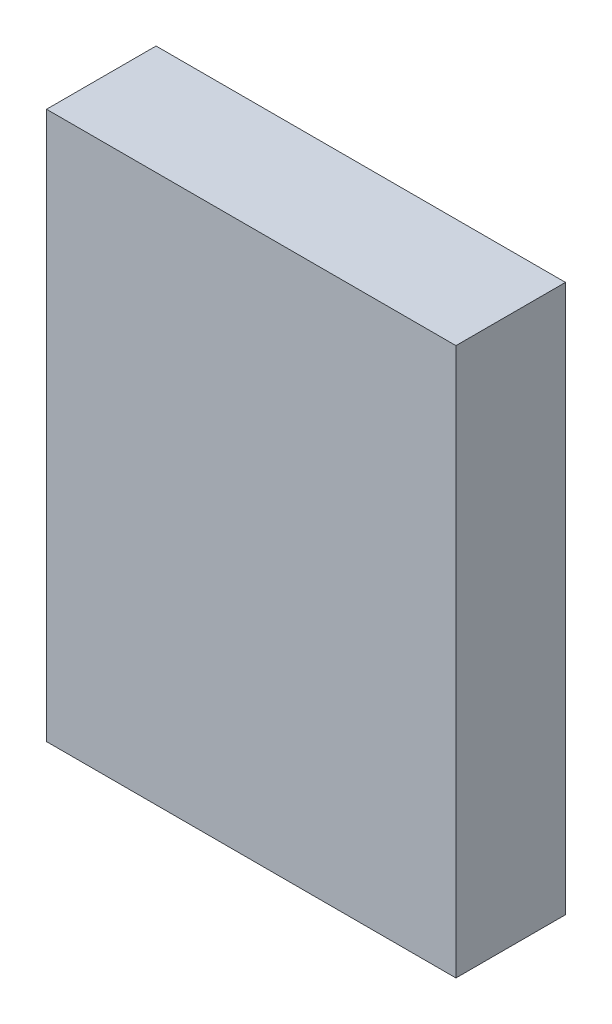
ISO-10303-21;
HEADER;
FILE_DESCRIPTION(('STEP AP214'),'2;1');
FILE_NAME('part.step','',(''),(''),'','','');
FILE_SCHEMA(('AUTOMOTIVE_DESIGN { 1 0 10303 214 1 1 1 1 }'));
ENDSEC;
DATA;
#1=APPLICATION_CONTEXT('core data for automotive mechanical design processes');
#2=APPLICATION_PROTOCOL_DEFINITION('international standard','automotive_design',2000,#1);
#3=PRODUCT_CONTEXT('',#1,'mechanical');
#4=PRODUCT('Part','Part','',(#3));
#5=PRODUCT_RELATED_PRODUCT_CATEGORY('part','',(#4));
#6=PRODUCT_DEFINITION_FORMATION('','',#4);
#7=PRODUCT_DEFINITION_CONTEXT('part definition',#1,'design');
#8=PRODUCT_DEFINITION('design','',#6,#7);
#9=PRODUCT_DEFINITION_SHAPE('','',#8);
#10=(LENGTH_UNIT() NAMED_UNIT(*) SI_UNIT(.MILLI.,.METRE.));
#11=(NAMED_UNIT(*) PLANE_ANGLE_UNIT() SI_UNIT($,.RADIAN.));
#12=(NAMED_UNIT(*) SI_UNIT($,.STERADIAN.) SOLID_ANGLE_UNIT());
#13=UNCERTAINTY_MEASURE_WITH_UNIT(LENGTH_MEASURE(1.E-05),#10,'distance_accuracy_value','');
#14=(GEOMETRIC_REPRESENTATION_CONTEXT(3) GLOBAL_UNCERTAINTY_ASSIGNED_CONTEXT((#13)) GLOBAL_UNIT_ASSIGNED_CONTEXT((#10,
#11,#12)) REPRESENTATION_CONTEXT('',''));
#15=CARTESIAN_POINT('',(0.,0.,0.));
#16=DIRECTION('',(0.,0.,1.));
#17=DIRECTION('',(1.,0.,0.));
#18=AXIS2_PLACEMENT_3D('',#15,#16,#17);
#19=CARTESIAN_POINT('',(-18.688963471708,-25.,10.));
#20=DIRECTION('',(0.,1.,0.));
#21=DIRECTION('',(0.,0.,1.));
#22=AXIS2_PLACEMENT_3D('',#19,#20,#21);
#23=PLANE('',#22);
#24=DIRECTION('',(1.,0.,0.));
#25=VECTOR('',#24,1.);
#26=CARTESIAN_POINT('',(-18.688963471708,-25.,0.));
#27=LINE('',#26,#25);
#28=CARTESIAN_POINT('',(-18.688963471708,-25.,0.));
#29=VERTEX_POINT('',#28);
#30=CARTESIAN_POINT('',(18.688963471708,-25.,0.));
#31=VERTEX_POINT('',#30);
#32=EDGE_CURVE('E108',#29,#31,#27,.T.);
#33=ORIENTED_EDGE('',*,*,#32,.T.);
#34=DIRECTION('',(0.,0.,-1.));
#35=VECTOR('',#34,1.);
#36=CARTESIAN_POINT('',(18.688963471708,-25.,10.));
#37=LINE('',#36,#35);
#38=CARTESIAN_POINT('',(18.688963471708,-25.,10.));
#39=VERTEX_POINT('',#38);
#40=EDGE_CURVE('E11',#39,#31,#37,.T.);
#41=ORIENTED_EDGE('',*,*,#40,.F.);
#42=DIRECTION('',(1.,0.,0.));
#43=VECTOR('',#42,1.);
#44=CARTESIAN_POINT('',(-18.688963471708,-25.,10.));
#45=LINE('',#44,#43);
#46=CARTESIAN_POINT('',(-18.688963471708,-25.,10.));
#47=VERTEX_POINT('',#46);
#48=EDGE_CURVE('E94',#47,#39,#45,.T.);
#49=ORIENTED_EDGE('',*,*,#48,.F.);
#50=DIRECTION('',(0.,0.,-1.));
#51=VECTOR('',#50,1.);
#52=CARTESIAN_POINT('',(-18.688963471708,-25.,10.));
#53=LINE('',#52,#51);
#54=EDGE_CURVE('E61',#47,#29,#53,.T.);
#55=ORIENTED_EDGE('',*,*,#54,.T.);
#56=EDGE_LOOP('',(#33,#41,#49,#55));
#57=FACE_BOUND('',#56,.T.);
#58=ADVANCED_FACE('F45',(#57),#23,.F.);
#59=CARTESIAN_POINT('',(18.688963471708,-25.,10.));
#60=DIRECTION('',(-1.,0.,0.));
#61=DIRECTION('',(0.,0.,1.));
#62=AXIS2_PLACEMENT_3D('',#59,#60,#61);
#63=PLANE('',#62);
#64=DIRECTION('',(0.,1.,0.));
#65=VECTOR('',#64,1.);
#66=CARTESIAN_POINT('',(18.688963471708,-25.,0.));
#67=LINE('',#66,#65);
#68=CARTESIAN_POINT('',(18.688963471708,25.,0.));
#69=VERTEX_POINT('',#68);
#70=EDGE_CURVE('E99',#31,#69,#67,.T.);
#71=ORIENTED_EDGE('',*,*,#70,.T.);
#72=DIRECTION('',(0.,0.,-1.));
#73=VECTOR('',#72,1.);
#74=CARTESIAN_POINT('',(18.688963471708,25.,10.));
#75=LINE('',#74,#73);
#76=CARTESIAN_POINT('',(18.688963471708,25.,10.));
#77=VERTEX_POINT('',#76);
#78=EDGE_CURVE('E53',#77,#69,#75,.T.);
#79=ORIENTED_EDGE('',*,*,#78,.F.);
#80=DIRECTION('',(0.,1.,0.));
#81=VECTOR('',#80,1.);
#82=CARTESIAN_POINT('',(18.688963471708,-25.,10.));
#83=LINE('',#82,#81);
#84=EDGE_CURVE('E86',#39,#77,#83,.T.);
#85=ORIENTED_EDGE('',*,*,#84,.F.);
#86=ORIENTED_EDGE('',*,*,#40,.T.);
#87=EDGE_LOOP('',(#71,#79,#85,#86));
#88=FACE_BOUND('',#87,.T.);
#89=ADVANCED_FACE('F98',(#88),#63,.F.);
#90=CARTESIAN_POINT('',(-18.688963471708,25.,10.));
#91=DIRECTION('',(0.,1.,0.));
#92=DIRECTION('',(0.,0.,1.));
#93=AXIS2_PLACEMENT_3D('',#90,#91,#92);
#94=PLANE('',#93);
#95=DIRECTION('',(1.,0.,0.));
#96=VECTOR('',#95,1.);
#97=CARTESIAN_POINT('',(-18.688963471708,25.,0.));
#98=LINE('',#97,#96);
#99=CARTESIAN_POINT('',(-18.688963471708,25.,0.));
#100=VERTEX_POINT('',#99);
#101=EDGE_CURVE('E111',#100,#69,#98,.T.);
#102=ORIENTED_EDGE('',*,*,#101,.F.);
#103=DIRECTION('',(0.,0.,-1.));
#104=VECTOR('',#103,1.);
#105=CARTESIAN_POINT('',(-18.688963471708,25.,10.));
#106=LINE('',#105,#104);
#107=CARTESIAN_POINT('',(-18.688963471708,25.,10.));
#108=VERTEX_POINT('',#107);
#109=EDGE_CURVE('E75',#108,#100,#106,.T.);
#110=ORIENTED_EDGE('',*,*,#109,.F.);
#111=DIRECTION('',(1.,0.,0.));
#112=VECTOR('',#111,1.);
#113=CARTESIAN_POINT('',(-18.688963471708,25.,10.));
#114=LINE('',#113,#112);
#115=EDGE_CURVE('E93',#108,#77,#114,.T.);
#116=ORIENTED_EDGE('',*,*,#115,.T.);
#117=ORIENTED_EDGE('',*,*,#78,.T.);
#118=EDGE_LOOP('',(#102,#110,#116,#117));
#119=FACE_BOUND('',#118,.T.);
#120=ADVANCED_FACE('F102',(#119),#94,.T.);
#121=CARTESIAN_POINT('',(-18.688963471708,-25.,10.));
#122=DIRECTION('',(-1.,0.,0.));
#123=DIRECTION('',(0.,0.,1.));
#124=AXIS2_PLACEMENT_3D('',#121,#122,#123);
#125=PLANE('',#124);
#126=DIRECTION('',(0.,1.,0.));
#127=VECTOR('',#126,1.);
#128=CARTESIAN_POINT('',(-18.688963471708,-25.,0.));
#129=LINE('',#128,#127);
#130=EDGE_CURVE('E113',#29,#100,#129,.T.);
#131=ORIENTED_EDGE('',*,*,#130,.F.);
#132=ORIENTED_EDGE('',*,*,#54,.F.);
#133=DIRECTION('',(0.,1.,0.));
#134=VECTOR('',#133,1.);
#135=CARTESIAN_POINT('',(-18.688963471708,-25.,10.));
#136=LINE('',#135,#134);
#137=EDGE_CURVE('E103',#47,#108,#136,.T.);
#138=ORIENTED_EDGE('',*,*,#137,.T.);
#139=ORIENTED_EDGE('',*,*,#109,.T.);
#140=EDGE_LOOP('',(#131,#132,#138,#139));
#141=FACE_BOUND('',#140,.T.);
#142=ADVANCED_FACE('F119',(#141),#125,.T.);
#143=CARTESIAN_POINT('',(0.,0.,10.));
#144=DIRECTION('',(0.,0.,1.));
#145=DIRECTION('',(1.,0.,0.));
#146=AXIS2_PLACEMENT_3D('',#143,#144,#145);
#147=PLANE('',#146);
#148=ORIENTED_EDGE('',*,*,#48,.T.);
#149=ORIENTED_EDGE('',*,*,#84,.T.);
#150=ORIENTED_EDGE('',*,*,#115,.F.);
#151=ORIENTED_EDGE('',*,*,#137,.F.);
#152=EDGE_LOOP('',(#148,#149,#150,#151));
#153=FACE_BOUND('',#152,.T.);
#154=ADVANCED_FACE('F90',(#153),#147,.T.);
#155=CARTESIAN_POINT('',(0.,0.,0.));
#156=DIRECTION('',(0.,0.,1.));
#157=DIRECTION('',(1.,0.,0.));
#158=AXIS2_PLACEMENT_3D('',#155,#156,#157);
#159=PLANE('',#158);
#160=ORIENTED_EDGE('',*,*,#32,.F.);
#161=ORIENTED_EDGE('',*,*,#130,.T.);
#162=ORIENTED_EDGE('',*,*,#101,.T.);
#163=ORIENTED_EDGE('',*,*,#70,.F.);
#164=EDGE_LOOP('',(#160,#161,#162,#163));
#165=FACE_BOUND('',#164,.T.);
#166=ADVANCED_FACE('F118',(#165),#159,.F.);
#167=CLOSED_SHELL('',(#58,#89,#120,#142,#154,#166));
#168=MANIFOLD_SOLID_BREP('B2',#167);
#169=ADVANCED_BREP_SHAPE_REPRESENTATION('',(#18,#168),#14);
#170=SHAPE_DEFINITION_REPRESENTATION(#9,#169);
ENDSEC;
END-ISO-10303-21;
